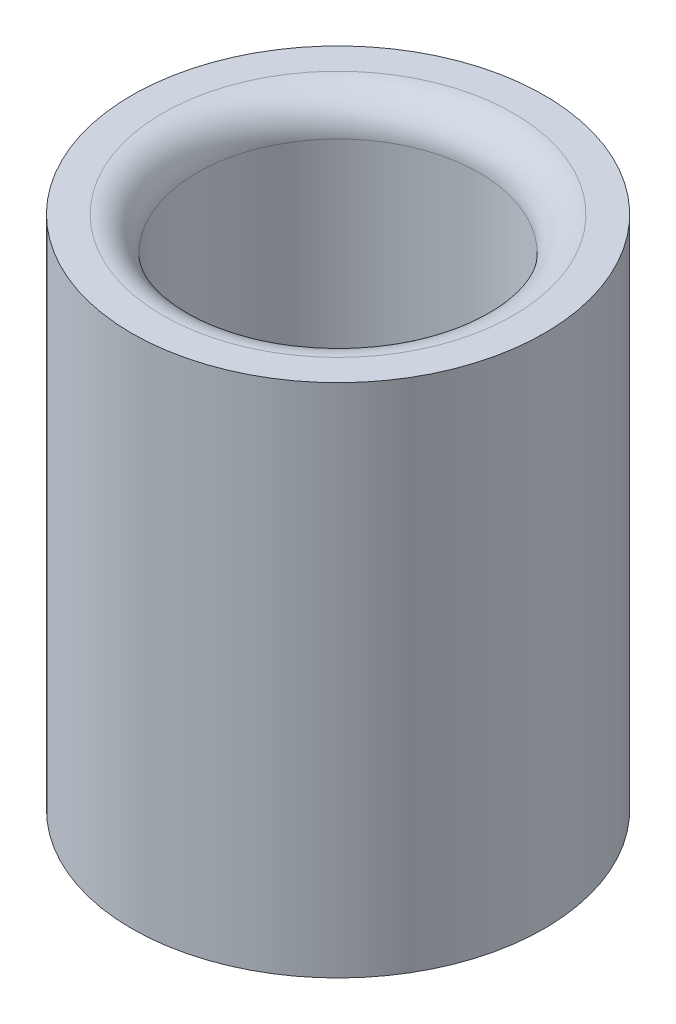
ISO-10303-21;
HEADER;
FILE_DESCRIPTION(('STEP AP214'),'2;1');
FILE_NAME('part.step','',(''),(''),'','','');
FILE_SCHEMA(('AUTOMOTIVE_DESIGN { 1 0 10303 214 1 1 1 1 }'));
ENDSEC;
DATA;
#1=APPLICATION_CONTEXT('core data for automotive mechanical design processes');
#2=APPLICATION_PROTOCOL_DEFINITION('international standard','automotive_design',2000,#1);
#3=PRODUCT_CONTEXT('',#1,'mechanical');
#4=PRODUCT('Part','Part','',(#3));
#5=PRODUCT_RELATED_PRODUCT_CATEGORY('part','',(#4));
#6=PRODUCT_DEFINITION_FORMATION('','',#4);
#7=PRODUCT_DEFINITION_CONTEXT('part definition',#1,'design');
#8=PRODUCT_DEFINITION('design','',#6,#7);
#9=PRODUCT_DEFINITION_SHAPE('','',#8);
#10=(LENGTH_UNIT() NAMED_UNIT(*) SI_UNIT(.MILLI.,.METRE.));
#11=(NAMED_UNIT(*) PLANE_ANGLE_UNIT() SI_UNIT($,.RADIAN.));
#12=(NAMED_UNIT(*) SI_UNIT($,.STERADIAN.) SOLID_ANGLE_UNIT());
#13=UNCERTAINTY_MEASURE_WITH_UNIT(LENGTH_MEASURE(1.E-05),#10,'distance_accuracy_value','');
#14=(GEOMETRIC_REPRESENTATION_CONTEXT(3) GLOBAL_UNCERTAINTY_ASSIGNED_CONTEXT((#13)) GLOBAL_UNIT_ASSIGNED_CONTEXT((#10,
#11,#12)) REPRESENTATION_CONTEXT('',''));
#15=CARTESIAN_POINT('',(0.,0.,0.));
#16=DIRECTION('',(0.,0.,1.));
#17=DIRECTION('',(1.,0.,0.));
#18=AXIS2_PLACEMENT_3D('',#15,#16,#17);
#19=CARTESIAN_POINT('',(0.,15.,0.));
#20=DIRECTION('',(0.,-1.,0.));
#21=DIRECTION('',(0.,0.,-1.));
#22=AXIS2_PLACEMENT_3D('',#19,#20,#21);
#23=CYLINDRICAL_SURFACE('',#22,6.);
#24=CARTESIAN_POINT('',(0.,15.,0.));
#25=DIRECTION('',(0.,1.,0.));
#26=DIRECTION('',(0.,0.,1.));
#27=AXIS2_PLACEMENT_3D('',#24,#25,#26);
#28=CIRCLE('',#27,6.);
#29=CARTESIAN_POINT('',(0.,15.,6.));
#30=VERTEX_POINT('',#29);
#31=EDGE_CURVE('E42',#30,#30,#28,.T.);
#32=ORIENTED_EDGE('',*,*,#31,.F.);
#33=EDGE_LOOP('',(#32));
#34=FACE_BOUND('',#33,.T.);
#35=CARTESIAN_POINT('',(0.,0.,0.));
#36=DIRECTION('',(0.,1.,0.));
#37=DIRECTION('',(0.,0.,1.));
#38=AXIS2_PLACEMENT_3D('',#35,#36,#37);
#39=CIRCLE('',#38,6.);
#40=CARTESIAN_POINT('',(0.,0.,6.));
#41=VERTEX_POINT('',#40);
#42=EDGE_CURVE('E46',#41,#41,#39,.T.);
#43=ORIENTED_EDGE('',*,*,#42,.T.);
#44=EDGE_LOOP('',(#43));
#45=FACE_BOUND('',#44,.T.);
#46=ADVANCED_FACE('F31',(#34,#45),#23,.T.);
#47=CARTESIAN_POINT('',(0.,15.,0.));
#48=DIRECTION('',(0.,1.,0.));
#49=DIRECTION('',(0.,0.,1.));
#50=AXIS2_PLACEMENT_3D('',#47,#48,#49);
#51=PLANE('',#50);
#52=CARTESIAN_POINT('',(0.,15.,0.));
#53=DIRECTION('',(0.,1.,0.));
#54=DIRECTION('',(0.,0.,1.));
#55=AXIS2_PLACEMENT_3D('',#52,#53,#54);
#56=CIRCLE('',#55,5.1);
#57=CARTESIAN_POINT('',(0.,15.,5.1));
#58=VERTEX_POINT('',#57);
#59=EDGE_CURVE('E10',#58,#58,#56,.F.);
#60=ORIENTED_EDGE('',*,*,#59,.T.);
#61=EDGE_LOOP('',(#60));
#62=FACE_BOUND('',#61,.T.);
#63=ORIENTED_EDGE('',*,*,#31,.T.);
#64=EDGE_LOOP('',(#63));
#65=FACE_BOUND('',#64,.T.);
#66=ADVANCED_FACE('F66',(#62,#65),#51,.T.);
#67=CARTESIAN_POINT('',(0.,0.,0.));
#68=DIRECTION('',(0.,1.,0.));
#69=DIRECTION('',(0.,0.,1.));
#70=AXIS2_PLACEMENT_3D('',#67,#68,#69);
#71=PLANE('',#70);
#72=ORIENTED_EDGE('',*,*,#42,.F.);
#73=EDGE_LOOP('',(#72));
#74=FACE_BOUND('',#73,.T.);
#75=ADVANCED_FACE('F59',(#74),#71,.F.);
#76=CARTESIAN_POINT('',(0.,6.,0.));
#77=DIRECTION('',(0.,1.,0.));
#78=DIRECTION('',(0.,0.,1.));
#79=AXIS2_PLACEMENT_3D('',#76,#77,#78);
#80=CYLINDRICAL_SURFACE('',#79,4.1);
#81=CARTESIAN_POINT('',(0.,14.,0.));
#82=DIRECTION('',(0.,1.,0.));
#83=DIRECTION('',(0.,0.,1.));
#84=AXIS2_PLACEMENT_3D('',#81,#82,#83);
#85=CIRCLE('',#84,4.1);
#86=CARTESIAN_POINT('',(0.,14.,4.1));
#87=VERTEX_POINT('',#86);
#88=EDGE_CURVE('E38',#87,#87,#85,.T.);
#89=ORIENTED_EDGE('',*,*,#88,.T.);
#90=EDGE_LOOP('',(#89));
#91=FACE_BOUND('',#90,.T.);
#92=CARTESIAN_POINT('',(0.,6.,0.));
#93=DIRECTION('',(0.,1.,0.));
#94=DIRECTION('',(0.,0.,1.));
#95=AXIS2_PLACEMENT_3D('',#92,#93,#94);
#96=CIRCLE('',#95,4.1);
#97=CARTESIAN_POINT('',(0.,6.,4.1));
#98=VERTEX_POINT('',#97);
#99=EDGE_CURVE('E50',#98,#98,#96,.T.);
#100=ORIENTED_EDGE('',*,*,#99,.F.);
#101=EDGE_LOOP('',(#100));
#102=FACE_BOUND('',#101,.T.);
#103=ADVANCED_FACE('F57',(#91,#102),#80,.F.);
#104=CARTESIAN_POINT('',(0.,6.,0.));
#105=DIRECTION('',(0.,1.,0.));
#106=DIRECTION('',(0.,0.,1.));
#107=AXIS2_PLACEMENT_3D('',#104,#105,#106);
#108=PLANE('',#107);
#109=ORIENTED_EDGE('',*,*,#99,.T.);
#110=EDGE_LOOP('',(#109));
#111=FACE_BOUND('',#110,.T.);
#112=ADVANCED_FACE('F55',(#111),#108,.T.);
#113=CARTESIAN_POINT('',(0.,14.,0.));
#114=DIRECTION('',(0.,1.,0.));
#115=DIRECTION('',(0.,0.,1.));
#116=AXIS2_PLACEMENT_3D('',#113,#114,#115);
#117=TOROIDAL_SURFACE('',#116,5.1,1.);
#118=ORIENTED_EDGE('',*,*,#59,.F.);
#119=EDGE_LOOP('',(#118));
#120=FACE_BOUND('',#119,.T.);
#121=ORIENTED_EDGE('',*,*,#88,.F.);
#122=EDGE_LOOP('',(#121));
#123=FACE_BOUND('',#122,.T.);
#124=ADVANCED_FACE('F33',(#120,#123),#117,.T.);
#125=CLOSED_SHELL('',(#46,#66,#75,#103,#112,#124));
#126=MANIFOLD_SOLID_BREP('B2',#125);
#127=ADVANCED_BREP_SHAPE_REPRESENTATION('',(#18,#126),#14);
#128=SHAPE_DEFINITION_REPRESENTATION(#9,#127);
ENDSEC;
END-ISO-10303-21;
